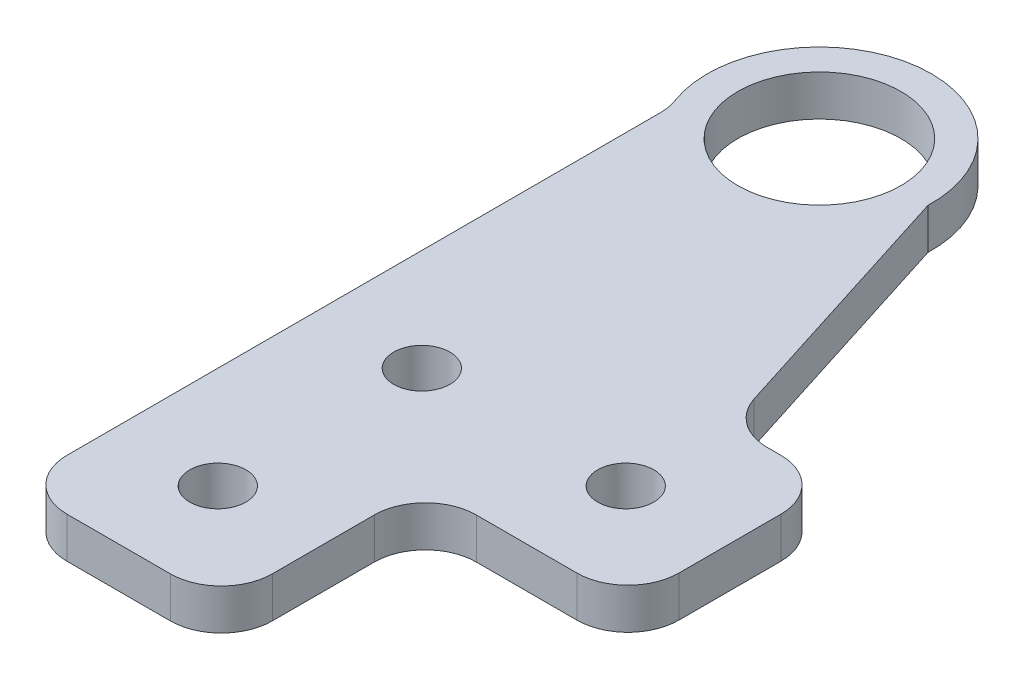
ISO-10303-21;
HEADER;
FILE_DESCRIPTION(('STEP AP214'),'2;1');
FILE_NAME('part.step','',(''),(''),'','','');
FILE_SCHEMA(('AUTOMOTIVE_DESIGN { 1 0 10303 214 1 1 1 1 }'));
ENDSEC;
DATA;
#1=APPLICATION_CONTEXT('core data for automotive mechanical design processes');
#2=APPLICATION_PROTOCOL_DEFINITION('international standard','automotive_design',2000,#1);
#3=PRODUCT_CONTEXT('',#1,'mechanical');
#4=PRODUCT('Part','Part','',(#3));
#5=PRODUCT_RELATED_PRODUCT_CATEGORY('part','',(#4));
#6=PRODUCT_DEFINITION_FORMATION('','',#4);
#7=PRODUCT_DEFINITION_CONTEXT('part definition',#1,'design');
#8=PRODUCT_DEFINITION('design','',#6,#7);
#9=PRODUCT_DEFINITION_SHAPE('','',#8);
#10=(LENGTH_UNIT() NAMED_UNIT(*) SI_UNIT(.MILLI.,.METRE.));
#11=(NAMED_UNIT(*) PLANE_ANGLE_UNIT() SI_UNIT($,.RADIAN.));
#12=(NAMED_UNIT(*) SI_UNIT($,.STERADIAN.) SOLID_ANGLE_UNIT());
#13=UNCERTAINTY_MEASURE_WITH_UNIT(LENGTH_MEASURE(1.E-05),#10,'distance_accuracy_value','');
#14=(GEOMETRIC_REPRESENTATION_CONTEXT(3) GLOBAL_UNCERTAINTY_ASSIGNED_CONTEXT((#13)) GLOBAL_UNIT_ASSIGNED_CONTEXT((#10,
#11,#12)) REPRESENTATION_CONTEXT('',''));
#15=CARTESIAN_POINT('',(0.,0.,0.));
#16=DIRECTION('',(0.,0.,1.));
#17=DIRECTION('',(1.,0.,0.));
#18=AXIS2_PLACEMENT_3D('',#15,#16,#17);
#19=CARTESIAN_POINT('',(-9.69201212461257,4.,-28.5336453955197));
#20=DIRECTION('',(0.,1.,0.));
#21=DIRECTION('',(0.,0.,1.));
#22=AXIS2_PLACEMENT_3D('',#19,#20,#21);
#23=PLANE('',#22);
#24=CARTESIAN_POINT('',(-9.68305050764084,4.,30.4608601809554));
#25=DIRECTION('',(0.,1.,0.));
#26=DIRECTION('',(0.,0.,1.));
#27=AXIS2_PLACEMENT_3D('',#24,#25,#26);
#28=CIRCLE('',#27,2.75);
#29=CARTESIAN_POINT('',(-9.68305050764084,4.,33.2108601809554));
#30=VERTEX_POINT('',#29);
#31=EDGE_CURVE('E382',#30,#30,#28,.T.);
#32=ORIENTED_EDGE('',*,*,#31,.F.);
#33=EDGE_LOOP('',(#32));
#34=FACE_BOUND('',#33,.T.);
#35=CARTESIAN_POINT('',(10.3169494923592,4.,10.4608601809554));
#36=DIRECTION('',(0.,1.,0.));
#37=DIRECTION('',(0.,0.,1.));
#38=AXIS2_PLACEMENT_3D('',#35,#36,#37);
#39=CIRCLE('',#38,2.75);
#40=CARTESIAN_POINT('',(10.3169494923592,4.,13.2108601809554));
#41=VERTEX_POINT('',#40);
#42=EDGE_CURVE('E190',#41,#41,#39,.T.);
#43=ORIENTED_EDGE('',*,*,#42,.F.);
#44=EDGE_LOOP('',(#43));
#45=FACE_BOUND('',#44,.T.);
#46=CARTESIAN_POINT('',(-9.69201212461257,4.,-28.5336453955197));
#47=DIRECTION('',(0.,1.,0.));
#48=DIRECTION('',(0.,0.,1.));
#49=AXIS2_PLACEMENT_3D('',#46,#47,#48);
#50=CIRCLE('',#49,10.9999999999998);
#51=CARTESIAN_POINT('',(1.30256704541295,4.,-28.188350052319));
#52=VERTEX_POINT('',#51);
#53=CARTESIAN_POINT('',(-19.9983510129444,4.,-24.689249640807));
#54=VERTEX_POINT('',#53);
#55=EDGE_CURVE('E229',#52,#54,#50,.T.);
#56=ORIENTED_EDGE('',*,*,#55,.T.);
#57=CARTESIAN_POINT('',(-24.6830505076409,4.,-22.9417970250284));
#58=DIRECTION('',(0.,-1.,0.));
#59=DIRECTION('',(0.,0.,-1.));
#60=AXIS2_PLACEMENT_3D('',#57,#58,#59);
#61=CIRCLE('',#60,5.);
#62=CARTESIAN_POINT('',(-19.6830505076409,4.,-22.9417970250284));
#63=VERTEX_POINT('',#62);
#64=EDGE_CURVE('E123',#54,#63,#61,.T.);
#65=ORIENTED_EDGE('',*,*,#64,.T.);
#66=DIRECTION('',(0.,0.,1.));
#67=VECTOR('',#66,1.);
#68=CARTESIAN_POINT('',(-19.6830505076409,4.,-22.9417970250284));
#69=LINE('',#68,#67);
#70=CARTESIAN_POINT('',(-19.6830505076409,4.,35.2493271062181));
#71=VERTEX_POINT('',#70);
#72=EDGE_CURVE('E278',#63,#71,#69,.T.);
#73=ORIENTED_EDGE('',*,*,#72,.T.);
#74=CARTESIAN_POINT('',(-14.6830505076409,4.,35.2493271062181));
#75=DIRECTION('',(0.,1.,0.));
#76=DIRECTION('',(0.,0.,1.));
#77=AXIS2_PLACEMENT_3D('',#74,#75,#76);
#78=CIRCLE('',#77,5.);
#79=CARTESIAN_POINT('',(-14.6830505076408,4.,40.2493271062181));
#80=VERTEX_POINT('',#79);
#81=EDGE_CURVE('E298',#71,#80,#78,.T.);
#82=ORIENTED_EDGE('',*,*,#81,.T.);
#83=DIRECTION('',(1.,0.,0.));
#84=VECTOR('',#83,1.);
#85=CARTESIAN_POINT('',(-14.6830505076408,4.,40.2493271062181));
#86=LINE('',#85,#84);
#87=CARTESIAN_POINT('',(-4.54956692577377,4.,40.2493271062181));
#88=VERTEX_POINT('',#87);
#89=EDGE_CURVE('E294',#80,#88,#86,.T.);
#90=ORIENTED_EDGE('',*,*,#89,.T.);
#91=CARTESIAN_POINT('',(-4.54956692577373,4.,35.2493271062181));
#92=DIRECTION('',(0.,1.,0.));
#93=DIRECTION('',(0.,0.,-1.));
#94=AXIS2_PLACEMENT_3D('',#91,#92,#93);
#95=CIRCLE('',#94,5.);
#96=CARTESIAN_POINT('',(0.450433074226266,4.,35.2493271062181));
#97=VERTEX_POINT('',#96);
#98=EDGE_CURVE('E297',#88,#97,#95,.T.);
#99=ORIENTED_EDGE('',*,*,#98,.T.);
#100=DIRECTION('',(0.,0.,-1.));
#101=VECTOR('',#100,1.);
#102=CARTESIAN_POINT('',(0.450433074226266,4.,35.2493271062181));
#103=LINE('',#102,#101);
#104=CARTESIAN_POINT('',(0.450433074226268,4.,25.2493271062182));
#105=VERTEX_POINT('',#104);
#106=EDGE_CURVE('E302',#97,#105,#103,.T.);
#107=ORIENTED_EDGE('',*,*,#106,.T.);
#108=CARTESIAN_POINT('',(5.45043307422627,4.,25.2493271062181));
#109=DIRECTION('',(0.,-1.,0.));
#110=DIRECTION('',(0.,0.,1.));
#111=AXIS2_PLACEMENT_3D('',#108,#109,#110);
#112=CIRCLE('',#111,5.);
#113=CARTESIAN_POINT('',(5.45043307422631,4.,20.2493271062181));
#114=VERTEX_POINT('',#113);
#115=EDGE_CURVE('E309',#105,#114,#112,.T.);
#116=ORIENTED_EDGE('',*,*,#115,.T.);
#117=DIRECTION('',(1.,0.,0.));
#118=VECTOR('',#117,1.);
#119=CARTESIAN_POINT('',(5.45043307422631,4.,20.2493271062181));
#120=LINE('',#119,#118);
#121=CARTESIAN_POINT('',(15.3169494923591,4.,20.2493271062181));
#122=VERTEX_POINT('',#121);
#123=EDGE_CURVE('E312',#114,#122,#120,.T.);
#124=ORIENTED_EDGE('',*,*,#123,.T.);
#125=CARTESIAN_POINT('',(15.3169494923592,4.,15.2493271062181));
#126=DIRECTION('',(0.,1.,0.));
#127=DIRECTION('',(0.,0.,-1.));
#128=AXIS2_PLACEMENT_3D('',#125,#126,#127);
#129=CIRCLE('',#128,5.);
#130=CARTESIAN_POINT('',(20.3169494923592,4.,15.2493271062181));
#131=VERTEX_POINT('',#130);
#132=EDGE_CURVE('E315',#122,#131,#129,.T.);
#133=ORIENTED_EDGE('',*,*,#132,.T.);
#134=DIRECTION('',(0.,0.,-1.));
#135=VECTOR('',#134,1.);
#136=CARTESIAN_POINT('',(20.3169494923592,4.,15.2493271062181));
#137=LINE('',#136,#135);
#138=CARTESIAN_POINT('',(20.3169494923592,4.,5.24932710621818));
#139=VERTEX_POINT('',#138);
#140=EDGE_CURVE('E318',#131,#139,#137,.T.);
#141=ORIENTED_EDGE('',*,*,#140,.T.);
#142=CARTESIAN_POINT('',(15.3169494923592,4.,5.24932710621815));
#143=DIRECTION('',(0.,1.,0.));
#144=DIRECTION('',(0.,0.,1.));
#145=AXIS2_PLACEMENT_3D('',#142,#143,#144);
#146=CIRCLE('',#145,5.);
#147=CARTESIAN_POINT('',(15.3169494923591,4.,0.249327106218146));
#148=VERTEX_POINT('',#147);
#149=EDGE_CURVE('E163',#139,#148,#146,.T.);
#150=ORIENTED_EDGE('',*,*,#149,.T.);
#151=DIRECTION('',(-1.,0.,0.));
#152=VECTOR('',#151,1.);
#153=CARTESIAN_POINT('',(13.9772035302035,4.,0.249327106218146));
#154=LINE('',#153,#152);
#155=CARTESIAN_POINT('',(13.9772035302035,4.,0.249327106218146));
#156=VERTEX_POINT('',#155);
#157=EDGE_CURVE('E157',#148,#156,#154,.T.);
#158=ORIENTED_EDGE('',*,*,#157,.T.);
#159=CARTESIAN_POINT('',(13.9772035302035,4.,-4.75067289378185));
#160=DIRECTION('',(0.,-1.,0.));
#161=DIRECTION('',(0.,0.,1.));
#162=AXIS2_PLACEMENT_3D('',#159,#160,#161);
#163=CIRCLE('',#162,5.);
#164=CARTESIAN_POINT('',(9.21093243581374,4.,-3.23982549752205));
#165=VERTEX_POINT('',#164);
#166=EDGE_CURVE('E161',#156,#165,#163,.T.);
#167=ORIENTED_EDGE('',*,*,#166,.T.);
#168=DIRECTION('',(-0.302169479251965,0.,-0.953254218877942));
#169=VECTOR('',#168,1.);
#170=CARTESIAN_POINT('',(9.21093243581374,4.,-3.23982549752205));
#171=LINE('',#170,#169);
#172=EDGE_CURVE('E59',#165,#52,#171,.T.);
#173=ORIENTED_EDGE('',*,*,#172,.T.);
#174=EDGE_LOOP('',(#56,#65,#73,#82,#90,#99,#107,#116,#124,#133,#141,#150,#158,#167,#173));
#175=FACE_BOUND('',#174,.T.);
#176=CARTESIAN_POINT('',(-9.68305050764084,4.,10.4608601809554));
#177=DIRECTION('',(0.,1.,0.));
#178=DIRECTION('',(0.,0.,1.));
#179=AXIS2_PLACEMENT_3D('',#176,#177,#178);
#180=CIRCLE('',#179,2.74999999999998);
#181=CARTESIAN_POINT('',(-9.68305050764084,4.,13.2108601809554));
#182=VERTEX_POINT('',#181);
#183=EDGE_CURVE('E390',#182,#182,#180,.T.);
#184=ORIENTED_EDGE('',*,*,#183,.F.);
#185=EDGE_LOOP('',(#184));
#186=FACE_BOUND('',#185,.T.);
#187=CARTESIAN_POINT('',(-9.69201212461257,4.,-28.5336453955197));
#188=DIRECTION('',(0.,1.,0.));
#189=DIRECTION('',(0.,0.,1.));
#190=AXIS2_PLACEMENT_3D('',#187,#188,#189);
#191=CIRCLE('',#190,8.);
#192=CARTESIAN_POINT('',(-9.69201212461257,4.,-20.5336453955197));
#193=VERTEX_POINT('',#192);
#194=EDGE_CURVE('E371',#193,#193,#191,.T.);
#195=ORIENTED_EDGE('',*,*,#194,.F.);
#196=EDGE_LOOP('',(#195));
#197=FACE_BOUND('',#196,.T.);
#198=ADVANCED_FACE('F41',(#34,#45,#175,#186,#197),#23,.T.);
#199=CARTESIAN_POINT('',(-9.69201212461257,0.,-28.5336453955197));
#200=DIRECTION('',(0.,1.,0.));
#201=DIRECTION('',(0.,0.,1.));
#202=AXIS2_PLACEMENT_3D('',#199,#200,#201);
#203=PLANE('',#202);
#204=CARTESIAN_POINT('',(-9.69201212461257,0.,-28.5336453955197));
#205=DIRECTION('',(0.,1.,0.));
#206=DIRECTION('',(0.,0.,1.));
#207=AXIS2_PLACEMENT_3D('',#204,#205,#206);
#208=CIRCLE('',#207,10.9999999999998);
#209=CARTESIAN_POINT('',(1.30256704541295,0.,-28.188350052319));
#210=VERTEX_POINT('',#209);
#211=CARTESIAN_POINT('',(-19.9983510129444,0.,-24.689249640807));
#212=VERTEX_POINT('',#211);
#213=EDGE_CURVE('E185',#210,#212,#208,.T.);
#214=ORIENTED_EDGE('',*,*,#213,.F.);
#215=DIRECTION('',(-0.302169479251965,0.,-0.953254218877942));
#216=VECTOR('',#215,1.);
#217=CARTESIAN_POINT('',(9.21093243581374,0.,-3.23982549752205));
#218=LINE('',#217,#216);
#219=CARTESIAN_POINT('',(9.21093243581374,0.,-3.23982549752205));
#220=VERTEX_POINT('',#219);
#221=EDGE_CURVE('E115',#220,#210,#218,.T.);
#222=ORIENTED_EDGE('',*,*,#221,.F.);
#223=CARTESIAN_POINT('',(13.9772035302035,0.,-4.75067289378185));
#224=DIRECTION('',(0.,-1.,0.));
#225=DIRECTION('',(0.,0.,1.));
#226=AXIS2_PLACEMENT_3D('',#223,#224,#225);
#227=CIRCLE('',#226,5.);
#228=CARTESIAN_POINT('',(13.9772035302035,0.,0.249327106218146));
#229=VERTEX_POINT('',#228);
#230=EDGE_CURVE('E109',#229,#220,#227,.T.);
#231=ORIENTED_EDGE('',*,*,#230,.F.);
#232=DIRECTION('',(-1.,0.,0.));
#233=VECTOR('',#232,1.);
#234=CARTESIAN_POINT('',(13.9772035302035,0.,0.249327106218146));
#235=LINE('',#234,#233);
#236=CARTESIAN_POINT('',(15.3169494923591,0.,0.249327106218146));
#237=VERTEX_POINT('',#236);
#238=EDGE_CURVE('E172',#237,#229,#235,.T.);
#239=ORIENTED_EDGE('',*,*,#238,.F.);
#240=CARTESIAN_POINT('',(15.3169494923592,0.,5.24932710621815));
#241=DIRECTION('',(0.,1.,0.));
#242=DIRECTION('',(0.,0.,1.));
#243=AXIS2_PLACEMENT_3D('',#240,#241,#242);
#244=CIRCLE('',#243,5.);
#245=CARTESIAN_POINT('',(20.3169494923592,0.,5.24932710621818));
#246=VERTEX_POINT('',#245);
#247=EDGE_CURVE('E220',#246,#237,#244,.T.);
#248=ORIENTED_EDGE('',*,*,#247,.F.);
#249=DIRECTION('',(0.,0.,-1.));
#250=VECTOR('',#249,1.);
#251=CARTESIAN_POINT('',(20.3169494923592,0.,15.2493271062181));
#252=LINE('',#251,#250);
#253=CARTESIAN_POINT('',(20.3169494923592,0.,15.2493271062181));
#254=VERTEX_POINT('',#253);
#255=EDGE_CURVE('E217',#254,#246,#252,.T.);
#256=ORIENTED_EDGE('',*,*,#255,.F.);
#257=CARTESIAN_POINT('',(15.3169494923592,0.,15.2493271062181));
#258=DIRECTION('',(0.,1.,0.));
#259=DIRECTION('',(0.,0.,-1.));
#260=AXIS2_PLACEMENT_3D('',#257,#258,#259);
#261=CIRCLE('',#260,5.);
#262=CARTESIAN_POINT('',(15.3169494923591,0.,20.2493271062181));
#263=VERTEX_POINT('',#262);
#264=EDGE_CURVE('E214',#263,#254,#261,.T.);
#265=ORIENTED_EDGE('',*,*,#264,.F.);
#266=DIRECTION('',(1.,0.,0.));
#267=VECTOR('',#266,1.);
#268=CARTESIAN_POINT('',(5.45043307422631,0.,20.2493271062181));
#269=LINE('',#268,#267);
#270=CARTESIAN_POINT('',(5.45043307422631,0.,20.2493271062181));
#271=VERTEX_POINT('',#270);
#272=EDGE_CURVE('E211',#271,#263,#269,.T.);
#273=ORIENTED_EDGE('',*,*,#272,.F.);
#274=CARTESIAN_POINT('',(5.45043307422627,0.,25.2493271062181));
#275=DIRECTION('',(0.,-1.,0.));
#276=DIRECTION('',(0.,0.,1.));
#277=AXIS2_PLACEMENT_3D('',#274,#275,#276);
#278=CIRCLE('',#277,5.);
#279=CARTESIAN_POINT('',(0.450433074226268,0.,25.2493271062182));
#280=VERTEX_POINT('',#279);
#281=EDGE_CURVE('E208',#280,#271,#278,.T.);
#282=ORIENTED_EDGE('',*,*,#281,.F.);
#283=DIRECTION('',(0.,0.,-1.));
#284=VECTOR('',#283,1.);
#285=CARTESIAN_POINT('',(0.450433074226266,0.,35.2493271062181));
#286=LINE('',#285,#284);
#287=CARTESIAN_POINT('',(0.450433074226266,0.,35.2493271062181));
#288=VERTEX_POINT('',#287);
#289=EDGE_CURVE('E205',#288,#280,#286,.T.);
#290=ORIENTED_EDGE('',*,*,#289,.F.);
#291=CARTESIAN_POINT('',(-4.54956692577373,0.,35.2493271062181));
#292=DIRECTION('',(0.,1.,0.));
#293=DIRECTION('',(0.,0.,-1.));
#294=AXIS2_PLACEMENT_3D('',#291,#292,#293);
#295=CIRCLE('',#294,5.);
#296=CARTESIAN_POINT('',(-4.54956692577377,0.,40.2493271062181));
#297=VERTEX_POINT('',#296);
#298=EDGE_CURVE('E202',#297,#288,#295,.T.);
#299=ORIENTED_EDGE('',*,*,#298,.F.);
#300=DIRECTION('',(1.,0.,0.));
#301=VECTOR('',#300,1.);
#302=CARTESIAN_POINT('',(-14.6830505076408,0.,40.2493271062181));
#303=LINE('',#302,#301);
#304=CARTESIAN_POINT('',(-14.6830505076408,0.,40.2493271062181));
#305=VERTEX_POINT('',#304);
#306=EDGE_CURVE('E199',#305,#297,#303,.T.);
#307=ORIENTED_EDGE('',*,*,#306,.F.);
#308=CARTESIAN_POINT('',(-14.6830505076409,0.,35.2493271062181));
#309=DIRECTION('',(0.,1.,0.));
#310=DIRECTION('',(0.,0.,1.));
#311=AXIS2_PLACEMENT_3D('',#308,#309,#310);
#312=CIRCLE('',#311,5.);
#313=CARTESIAN_POINT('',(-19.6830505076409,0.,35.2493271062181));
#314=VERTEX_POINT('',#313);
#315=EDGE_CURVE('E196',#314,#305,#312,.T.);
#316=ORIENTED_EDGE('',*,*,#315,.F.);
#317=DIRECTION('',(0.,0.,1.));
#318=VECTOR('',#317,1.);
#319=CARTESIAN_POINT('',(-19.6830505076409,0.,-22.9417970250284));
#320=LINE('',#319,#318);
#321=CARTESIAN_POINT('',(-19.6830505076409,0.,-22.9417970250284));
#322=VERTEX_POINT('',#321);
#323=EDGE_CURVE('E193',#322,#314,#320,.T.);
#324=ORIENTED_EDGE('',*,*,#323,.F.);
#325=CARTESIAN_POINT('',(-24.6830505076409,0.,-22.9417970250284));
#326=DIRECTION('',(0.,-1.,0.));
#327=DIRECTION('',(0.,0.,-1.));
#328=AXIS2_PLACEMENT_3D('',#325,#326,#327);
#329=CIRCLE('',#328,5.);
#330=EDGE_CURVE('E189',#212,#322,#329,.T.);
#331=ORIENTED_EDGE('',*,*,#330,.F.);
#332=EDGE_LOOP('',(#214,#222,#231,#239,#248,#256,#265,#273,#282,#290,#299,#307,#316,#324,#331));
#333=FACE_BOUND('',#332,.T.);
#334=CARTESIAN_POINT('',(10.3169494923592,0.,10.4608601809554));
#335=DIRECTION('',(0.,1.,0.));
#336=DIRECTION('',(0.,0.,1.));
#337=AXIS2_PLACEMENT_3D('',#334,#335,#336);
#338=CIRCLE('',#337,2.75);
#339=CARTESIAN_POINT('',(10.3169494923592,0.,13.2108601809554));
#340=VERTEX_POINT('',#339);
#341=EDGE_CURVE('E394',#340,#340,#338,.T.);
#342=ORIENTED_EDGE('',*,*,#341,.T.);
#343=EDGE_LOOP('',(#342));
#344=FACE_BOUND('',#343,.T.);
#345=CARTESIAN_POINT('',(-9.68305050764084,0.,10.4608601809554));
#346=DIRECTION('',(0.,1.,0.));
#347=DIRECTION('',(0.,0.,1.));
#348=AXIS2_PLACEMENT_3D('',#345,#346,#347);
#349=CIRCLE('',#348,2.74999999999998);
#350=CARTESIAN_POINT('',(-9.68305050764084,0.,13.2108601809554));
#351=VERTEX_POINT('',#350);
#352=EDGE_CURVE('E386',#351,#351,#349,.T.);
#353=ORIENTED_EDGE('',*,*,#352,.T.);
#354=EDGE_LOOP('',(#353));
#355=FACE_BOUND('',#354,.T.);
#356=CARTESIAN_POINT('',(-9.68305050764084,0.,30.4608601809554));
#357=DIRECTION('',(0.,1.,0.));
#358=DIRECTION('',(0.,0.,1.));
#359=AXIS2_PLACEMENT_3D('',#356,#357,#358);
#360=CIRCLE('',#359,2.75);
#361=CARTESIAN_POINT('',(-9.68305050764084,0.,33.2108601809554));
#362=VERTEX_POINT('',#361);
#363=EDGE_CURVE('E379',#362,#362,#360,.T.);
#364=ORIENTED_EDGE('',*,*,#363,.T.);
#365=EDGE_LOOP('',(#364));
#366=FACE_BOUND('',#365,.T.);
#367=CARTESIAN_POINT('',(-9.69201212461257,0.,-28.5336453955197));
#368=DIRECTION('',(0.,1.,0.));
#369=DIRECTION('',(0.,0.,1.));
#370=AXIS2_PLACEMENT_3D('',#367,#368,#369);
#371=CIRCLE('',#370,8.);
#372=CARTESIAN_POINT('',(-9.69201212461257,0.,-20.5336453955197));
#373=VERTEX_POINT('',#372);
#374=EDGE_CURVE('E374',#373,#373,#371,.T.);
#375=ORIENTED_EDGE('',*,*,#374,.T.);
#376=EDGE_LOOP('',(#375));
#377=FACE_BOUND('',#376,.T.);
#378=ADVANCED_FACE('F282',(#333,#344,#355,#366,#377),#203,.F.);
#379=CARTESIAN_POINT('',(-9.69201212461257,4.,-28.5336453955197));
#380=DIRECTION('',(0.,-1.,0.));
#381=DIRECTION('',(0.,0.,-1.));
#382=AXIS2_PLACEMENT_3D('',#379,#380,#381);
#383=CYLINDRICAL_SURFACE('',#382,10.9999999999998);
#384=ORIENTED_EDGE('',*,*,#213,.T.);
#385=DIRECTION('',(0.,-1.,0.));
#386=VECTOR('',#385,1.);
#387=CARTESIAN_POINT('',(-19.9983510129444,4.,-24.689249640807));
#388=LINE('',#387,#386);
#389=EDGE_CURVE('E11',#54,#212,#388,.T.);
#390=ORIENTED_EDGE('',*,*,#389,.F.);
#391=ORIENTED_EDGE('',*,*,#55,.F.);
#392=DIRECTION('',(0.,-1.,0.));
#393=VECTOR('',#392,1.);
#394=CARTESIAN_POINT('',(1.30256704541295,4.,-28.188350052319));
#395=LINE('',#394,#393);
#396=EDGE_CURVE('E181',#52,#210,#395,.T.);
#397=ORIENTED_EDGE('',*,*,#396,.T.);
#398=EDGE_LOOP('',(#384,#390,#391,#397));
#399=FACE_BOUND('',#398,.T.);
#400=ADVANCED_FACE('F43',(#399),#383,.T.);
#401=CARTESIAN_POINT('',(-24.6830505076409,4.,-22.9417970250284));
#402=DIRECTION('',(0.,-1.,0.));
#403=DIRECTION('',(0.,0.,-1.));
#404=AXIS2_PLACEMENT_3D('',#401,#402,#403);
#405=CYLINDRICAL_SURFACE('',#404,5.);
#406=ORIENTED_EDGE('',*,*,#330,.T.);
#407=DIRECTION('',(0.,-1.,0.));
#408=VECTOR('',#407,1.);
#409=CARTESIAN_POINT('',(-19.6830505076409,4.,-22.9417970250284));
#410=LINE('',#409,#408);
#411=EDGE_CURVE('E51',#63,#322,#410,.T.);
#412=ORIENTED_EDGE('',*,*,#411,.F.);
#413=ORIENTED_EDGE('',*,*,#64,.F.);
#414=ORIENTED_EDGE('',*,*,#389,.T.);
#415=EDGE_LOOP('',(#406,#412,#413,#414));
#416=FACE_BOUND('',#415,.T.);
#417=ADVANCED_FACE('F540',(#416),#405,.F.);
#418=CARTESIAN_POINT('',(-19.6830505076409,4.,-22.9417970250284));
#419=DIRECTION('',(1.,0.,0.));
#420=DIRECTION('',(0.,0.,-1.));
#421=AXIS2_PLACEMENT_3D('',#418,#419,#420);
#422=PLANE('',#421);
#423=ORIENTED_EDGE('',*,*,#323,.T.);
#424=DIRECTION('',(0.,-1.,0.));
#425=VECTOR('',#424,1.);
#426=CARTESIAN_POINT('',(-19.6830505076409,4.,35.2493271062181));
#427=LINE('',#426,#425);
#428=EDGE_CURVE('E268',#71,#314,#427,.T.);
#429=ORIENTED_EDGE('',*,*,#428,.F.);
#430=ORIENTED_EDGE('',*,*,#72,.F.);
#431=ORIENTED_EDGE('',*,*,#411,.T.);
#432=EDGE_LOOP('',(#423,#429,#430,#431));
#433=FACE_BOUND('',#432,.T.);
#434=ADVANCED_FACE('F276',(#433),#422,.F.);
#435=CARTESIAN_POINT('',(-14.6830505076409,4.,35.2493271062181));
#436=DIRECTION('',(0.,-1.,0.));
#437=DIRECTION('',(0.,0.,-1.));
#438=AXIS2_PLACEMENT_3D('',#435,#436,#437);
#439=CYLINDRICAL_SURFACE('',#438,5.);
#440=ORIENTED_EDGE('',*,*,#315,.T.);
#441=DIRECTION('',(0.,-1.,0.));
#442=VECTOR('',#441,1.);
#443=CARTESIAN_POINT('',(-14.6830505076408,4.,40.2493271062181));
#444=LINE('',#443,#442);
#445=EDGE_CURVE('E264',#80,#305,#444,.T.);
#446=ORIENTED_EDGE('',*,*,#445,.F.);
#447=ORIENTED_EDGE('',*,*,#81,.F.);
#448=ORIENTED_EDGE('',*,*,#428,.T.);
#449=EDGE_LOOP('',(#440,#446,#447,#448));
#450=FACE_BOUND('',#449,.T.);
#451=ADVANCED_FACE('F288',(#450),#439,.T.);
#452=CARTESIAN_POINT('',(-14.6830505076408,4.,40.2493271062181));
#453=DIRECTION('',(0.,0.,-1.));
#454=DIRECTION('',(-1.,0.,0.));
#455=AXIS2_PLACEMENT_3D('',#452,#453,#454);
#456=PLANE('',#455);
#457=ORIENTED_EDGE('',*,*,#306,.T.);
#458=DIRECTION('',(0.,-1.,0.));
#459=VECTOR('',#458,1.);
#460=CARTESIAN_POINT('',(-4.54956692577377,4.,40.2493271062181));
#461=LINE('',#460,#459);
#462=EDGE_CURVE('E260',#88,#297,#461,.T.);
#463=ORIENTED_EDGE('',*,*,#462,.F.);
#464=ORIENTED_EDGE('',*,*,#89,.F.);
#465=ORIENTED_EDGE('',*,*,#445,.T.);
#466=EDGE_LOOP('',(#457,#463,#464,#465));
#467=FACE_BOUND('',#466,.T.);
#468=ADVANCED_FACE('F292',(#467),#456,.F.);
#469=CARTESIAN_POINT('',(-4.54956692577373,4.,35.2493271062181));
#470=DIRECTION('',(0.,-1.,0.));
#471=DIRECTION('',(0.,0.,-1.));
#472=AXIS2_PLACEMENT_3D('',#469,#470,#471);
#473=CYLINDRICAL_SURFACE('',#472,5.);
#474=ORIENTED_EDGE('',*,*,#298,.T.);
#475=DIRECTION('',(0.,-1.,0.));
#476=VECTOR('',#475,1.);
#477=CARTESIAN_POINT('',(0.450433074226266,4.,35.2493271062181));
#478=LINE('',#477,#476);
#479=EDGE_CURVE('E256',#97,#288,#478,.T.);
#480=ORIENTED_EDGE('',*,*,#479,.F.);
#481=ORIENTED_EDGE('',*,*,#98,.F.);
#482=ORIENTED_EDGE('',*,*,#462,.T.);
#483=EDGE_LOOP('',(#474,#480,#481,#482));
#484=FACE_BOUND('',#483,.T.);
#485=ADVANCED_FACE('F505',(#484),#473,.T.);
#486=CARTESIAN_POINT('',(0.450433074226266,4.,35.2493271062181));
#487=DIRECTION('',(-1.,0.,0.));
#488=DIRECTION('',(0.,0.,1.));
#489=AXIS2_PLACEMENT_3D('',#486,#487,#488);
#490=PLANE('',#489);
#491=ORIENTED_EDGE('',*,*,#289,.T.);
#492=DIRECTION('',(0.,-1.,0.));
#493=VECTOR('',#492,1.);
#494=CARTESIAN_POINT('',(0.450433074226268,4.,25.2493271062182));
#495=LINE('',#494,#493);
#496=EDGE_CURVE('E252',#105,#280,#495,.T.);
#497=ORIENTED_EDGE('',*,*,#496,.F.);
#498=ORIENTED_EDGE('',*,*,#106,.F.);
#499=ORIENTED_EDGE('',*,*,#479,.T.);
#500=EDGE_LOOP('',(#491,#497,#498,#499));
#501=FACE_BOUND('',#500,.T.);
#502=ADVANCED_FACE('F495',(#501),#490,.F.);
#503=CARTESIAN_POINT('',(5.45043307422627,4.,25.2493271062181));
#504=DIRECTION('',(0.,-1.,0.));
#505=DIRECTION('',(0.,0.,-1.));
#506=AXIS2_PLACEMENT_3D('',#503,#504,#505);
#507=CYLINDRICAL_SURFACE('',#506,5.);
#508=ORIENTED_EDGE('',*,*,#281,.T.);
#509=DIRECTION('',(0.,-1.,0.));
#510=VECTOR('',#509,1.);
#511=CARTESIAN_POINT('',(5.45043307422631,4.,20.2493271062181));
#512=LINE('',#511,#510);
#513=EDGE_CURVE('E248',#114,#271,#512,.T.);
#514=ORIENTED_EDGE('',*,*,#513,.F.);
#515=ORIENTED_EDGE('',*,*,#115,.F.);
#516=ORIENTED_EDGE('',*,*,#496,.T.);
#517=EDGE_LOOP('',(#508,#514,#515,#516));
#518=FACE_BOUND('',#517,.T.);
#519=ADVANCED_FACE('F485',(#518),#507,.F.);
#520=CARTESIAN_POINT('',(5.45043307422631,4.,20.2493271062181));
#521=DIRECTION('',(0.,0.,-1.));
#522=DIRECTION('',(-1.,0.,0.));
#523=AXIS2_PLACEMENT_3D('',#520,#521,#522);
#524=PLANE('',#523);
#525=ORIENTED_EDGE('',*,*,#272,.T.);
#526=DIRECTION('',(0.,-1.,0.));
#527=VECTOR('',#526,1.);
#528=CARTESIAN_POINT('',(15.3169494923591,4.,20.2493271062181));
#529=LINE('',#528,#527);
#530=EDGE_CURVE('E244',#122,#263,#529,.T.);
#531=ORIENTED_EDGE('',*,*,#530,.F.);
#532=ORIENTED_EDGE('',*,*,#123,.F.);
#533=ORIENTED_EDGE('',*,*,#513,.T.);
#534=EDGE_LOOP('',(#525,#531,#532,#533));
#535=FACE_BOUND('',#534,.T.);
#536=ADVANCED_FACE('F475',(#535),#524,.F.);
#537=CARTESIAN_POINT('',(15.3169494923592,4.,15.2493271062181));
#538=DIRECTION('',(0.,-1.,0.));
#539=DIRECTION('',(0.,0.,-1.));
#540=AXIS2_PLACEMENT_3D('',#537,#538,#539);
#541=CYLINDRICAL_SURFACE('',#540,5.);
#542=ORIENTED_EDGE('',*,*,#264,.T.);
#543=DIRECTION('',(0.,-1.,0.));
#544=VECTOR('',#543,1.);
#545=CARTESIAN_POINT('',(20.3169494923592,4.,15.2493271062181));
#546=LINE('',#545,#544);
#547=EDGE_CURVE('E240',#131,#254,#546,.T.);
#548=ORIENTED_EDGE('',*,*,#547,.F.);
#549=ORIENTED_EDGE('',*,*,#132,.F.);
#550=ORIENTED_EDGE('',*,*,#530,.T.);
#551=EDGE_LOOP('',(#542,#548,#549,#550));
#552=FACE_BOUND('',#551,.T.);
#553=ADVANCED_FACE('F466',(#552),#541,.T.);
#554=CARTESIAN_POINT('',(20.3169494923592,4.,15.2493271062181));
#555=DIRECTION('',(-1.,0.,0.));
#556=DIRECTION('',(0.,0.,1.));
#557=AXIS2_PLACEMENT_3D('',#554,#555,#556);
#558=PLANE('',#557);
#559=ORIENTED_EDGE('',*,*,#255,.T.);
#560=DIRECTION('',(0.,-1.,0.));
#561=VECTOR('',#560,1.);
#562=CARTESIAN_POINT('',(20.3169494923592,4.,5.24932710621818));
#563=LINE('',#562,#561);
#564=EDGE_CURVE('E236',#139,#246,#563,.T.);
#565=ORIENTED_EDGE('',*,*,#564,.F.);
#566=ORIENTED_EDGE('',*,*,#140,.F.);
#567=ORIENTED_EDGE('',*,*,#547,.T.);
#568=EDGE_LOOP('',(#559,#565,#566,#567));
#569=FACE_BOUND('',#568,.T.);
#570=ADVANCED_FACE('F326',(#569),#558,.F.);
#571=CARTESIAN_POINT('',(15.3169494923592,4.,5.24932710621815));
#572=DIRECTION('',(0.,-1.,0.));
#573=DIRECTION('',(0.,0.,-1.));
#574=AXIS2_PLACEMENT_3D('',#571,#572,#573);
#575=CYLINDRICAL_SURFACE('',#574,5.);
#576=ORIENTED_EDGE('',*,*,#247,.T.);
#577=DIRECTION('',(0.,-1.,0.));
#578=VECTOR('',#577,1.);
#579=CARTESIAN_POINT('',(15.3169494923591,4.,0.249327106218146));
#580=LINE('',#579,#578);
#581=EDGE_CURVE('E174',#148,#237,#580,.T.);
#582=ORIENTED_EDGE('',*,*,#581,.F.);
#583=ORIENTED_EDGE('',*,*,#149,.F.);
#584=ORIENTED_EDGE('',*,*,#564,.T.);
#585=EDGE_LOOP('',(#576,#582,#583,#584));
#586=FACE_BOUND('',#585,.T.);
#587=ADVANCED_FACE('F330',(#586),#575,.T.);
#588=CARTESIAN_POINT('',(13.9772035302035,4.,0.249327106218146));
#589=DIRECTION('',(0.,0.,1.));
#590=DIRECTION('',(1.,0.,0.));
#591=AXIS2_PLACEMENT_3D('',#588,#589,#590);
#592=PLANE('',#591);
#593=ORIENTED_EDGE('',*,*,#238,.T.);
#594=DIRECTION('',(0.,-1.,0.));
#595=VECTOR('',#594,1.);
#596=CARTESIAN_POINT('',(13.9772035302035,4.,0.249327106218146));
#597=LINE('',#596,#595);
#598=EDGE_CURVE('E169',#156,#229,#597,.T.);
#599=ORIENTED_EDGE('',*,*,#598,.F.);
#600=ORIENTED_EDGE('',*,*,#157,.F.);
#601=ORIENTED_EDGE('',*,*,#581,.T.);
#602=EDGE_LOOP('',(#593,#599,#600,#601));
#603=FACE_BOUND('',#602,.T.);
#604=ADVANCED_FACE('F170',(#603),#592,.F.);
#605=CARTESIAN_POINT('',(13.9772035302035,4.,-4.75067289378185));
#606=DIRECTION('',(0.,-1.,0.));
#607=DIRECTION('',(0.,0.,-1.));
#608=AXIS2_PLACEMENT_3D('',#605,#606,#607);
#609=CYLINDRICAL_SURFACE('',#608,5.);
#610=ORIENTED_EDGE('',*,*,#230,.T.);
#611=DIRECTION('',(0.,-1.,0.));
#612=VECTOR('',#611,1.);
#613=CARTESIAN_POINT('',(9.21093243581374,4.,-3.23982549752205));
#614=LINE('',#613,#612);
#615=EDGE_CURVE('E175',#165,#220,#614,.T.);
#616=ORIENTED_EDGE('',*,*,#615,.F.);
#617=ORIENTED_EDGE('',*,*,#166,.F.);
#618=ORIENTED_EDGE('',*,*,#598,.T.);
#619=EDGE_LOOP('',(#610,#616,#617,#618));
#620=FACE_BOUND('',#619,.T.);
#621=ADVANCED_FACE('F177',(#620),#609,.F.);
#622=CARTESIAN_POINT('',(9.21093243581374,4.,-3.23982549752205));
#623=DIRECTION('',(-0.953254218877942,0.,0.302169479251965));
#624=DIRECTION('',(0.302169479251965,0.,0.953254218877942));
#625=AXIS2_PLACEMENT_3D('',#622,#623,#624);
#626=PLANE('',#625);
#627=ORIENTED_EDGE('',*,*,#221,.T.);
#628=ORIENTED_EDGE('',*,*,#396,.F.);
#629=ORIENTED_EDGE('',*,*,#172,.F.);
#630=ORIENTED_EDGE('',*,*,#615,.T.);
#631=EDGE_LOOP('',(#627,#628,#629,#630));
#632=FACE_BOUND('',#631,.T.);
#633=ADVANCED_FACE('F334',(#632),#626,.F.);
#634=CARTESIAN_POINT('',(10.3169494923592,4.,10.4608601809554));
#635=DIRECTION('',(0.,-1.,0.));
#636=DIRECTION('',(0.,0.,-1.));
#637=AXIS2_PLACEMENT_3D('',#634,#635,#636);
#638=CYLINDRICAL_SURFACE('',#637,2.75);
#639=ORIENTED_EDGE('',*,*,#42,.T.);
#640=EDGE_LOOP('',(#639));
#641=FACE_BOUND('',#640,.T.);
#642=ORIENTED_EDGE('',*,*,#341,.F.);
#643=EDGE_LOOP('',(#642));
#644=FACE_BOUND('',#643,.T.);
#645=ADVANCED_FACE('F336',(#641,#644),#638,.F.);
#646=CARTESIAN_POINT('',(-9.68305050764084,4.,10.4608601809554));
#647=DIRECTION('',(0.,-1.,0.));
#648=DIRECTION('',(0.,0.,-1.));
#649=AXIS2_PLACEMENT_3D('',#646,#647,#648);
#650=CYLINDRICAL_SURFACE('',#649,2.74999999999998);
#651=ORIENTED_EDGE('',*,*,#183,.T.);
#652=EDGE_LOOP('',(#651));
#653=FACE_BOUND('',#652,.T.);
#654=ORIENTED_EDGE('',*,*,#352,.F.);
#655=EDGE_LOOP('',(#654));
#656=FACE_BOUND('',#655,.T.);
#657=ADVANCED_FACE('F342',(#653,#656),#650,.F.);
#658=CARTESIAN_POINT('',(-9.68305050764084,4.,30.4608601809554));
#659=DIRECTION('',(0.,-1.,0.));
#660=DIRECTION('',(0.,0.,-1.));
#661=AXIS2_PLACEMENT_3D('',#658,#659,#660);
#662=CYLINDRICAL_SURFACE('',#661,2.75);
#663=ORIENTED_EDGE('',*,*,#31,.T.);
#664=EDGE_LOOP('',(#663));
#665=FACE_BOUND('',#664,.T.);
#666=ORIENTED_EDGE('',*,*,#363,.F.);
#667=EDGE_LOOP('',(#666));
#668=FACE_BOUND('',#667,.T.);
#669=ADVANCED_FACE('F358',(#665,#668),#662,.F.);
#670=CARTESIAN_POINT('',(-9.69201212461257,4.,-28.5336453955197));
#671=DIRECTION('',(0.,-1.,0.));
#672=DIRECTION('',(0.,0.,-1.));
#673=AXIS2_PLACEMENT_3D('',#670,#671,#672);
#674=CYLINDRICAL_SURFACE('',#673,8.);
#675=ORIENTED_EDGE('',*,*,#194,.T.);
#676=EDGE_LOOP('',(#675));
#677=FACE_BOUND('',#676,.T.);
#678=ORIENTED_EDGE('',*,*,#374,.F.);
#679=EDGE_LOOP('',(#678));
#680=FACE_BOUND('',#679,.T.);
#681=ADVANCED_FACE('F362',(#677,#680),#674,.F.);
#682=CLOSED_SHELL('',(#198,#378,#400,#417,#434,#451,#468,#485,#502,#519,#536,#553,#570,#587,
#604,#621,#633,#645,#657,#669,#681));
#683=MANIFOLD_SOLID_BREP('B2',#682);
#684=ADVANCED_BREP_SHAPE_REPRESENTATION('',(#18,#683),#14);
#685=SHAPE_DEFINITION_REPRESENTATION(#9,#684);
ENDSEC;
END-ISO-10303-21;
